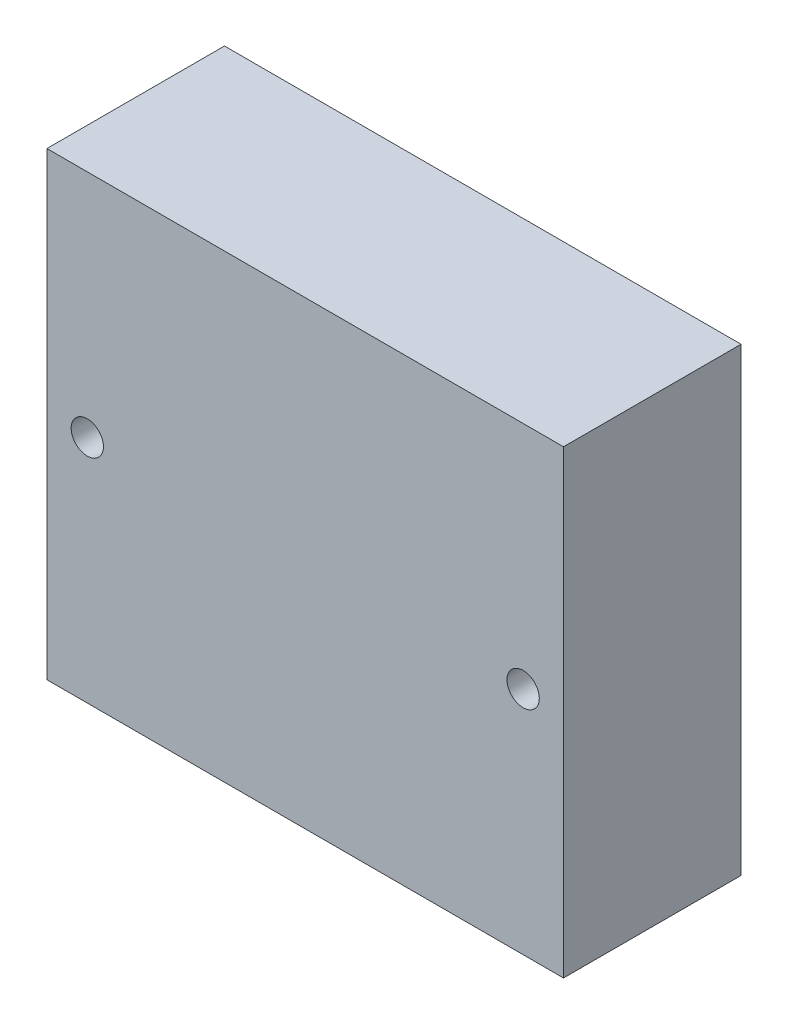
ISO-10303-21;
HEADER;
FILE_DESCRIPTION(('STEP AP214'),'2;1');
FILE_NAME('part.step','',(''),(''),'','','');
FILE_SCHEMA(('AUTOMOTIVE_DESIGN { 1 0 10303 214 1 1 1 1 }'));
ENDSEC;
DATA;
#1=APPLICATION_CONTEXT('core data for automotive mechanical design processes');
#2=APPLICATION_PROTOCOL_DEFINITION('international standard','automotive_design',2000,#1);
#3=PRODUCT_CONTEXT('',#1,'mechanical');
#4=PRODUCT('Part','Part','',(#3));
#5=PRODUCT_RELATED_PRODUCT_CATEGORY('part','',(#4));
#6=PRODUCT_DEFINITION_FORMATION('','',#4);
#7=PRODUCT_DEFINITION_CONTEXT('part definition',#1,'design');
#8=PRODUCT_DEFINITION('design','',#6,#7);
#9=PRODUCT_DEFINITION_SHAPE('','',#8);
#10=(LENGTH_UNIT() NAMED_UNIT(*) SI_UNIT(.MILLI.,.METRE.));
#11=(NAMED_UNIT(*) PLANE_ANGLE_UNIT() SI_UNIT($,.RADIAN.));
#12=(NAMED_UNIT(*) SI_UNIT($,.STERADIAN.) SOLID_ANGLE_UNIT());
#13=UNCERTAINTY_MEASURE_WITH_UNIT(LENGTH_MEASURE(1.E-05),#10,'distance_accuracy_value','');
#14=(GEOMETRIC_REPRESENTATION_CONTEXT(3) GLOBAL_UNCERTAINTY_ASSIGNED_CONTEXT((#13)) GLOBAL_UNIT_ASSIGNED_CONTEXT((#10,
#11,#12)) REPRESENTATION_CONTEXT('',''));
#15=CARTESIAN_POINT('',(0.,0.,0.));
#16=DIRECTION('',(0.,0.,1.));
#17=DIRECTION('',(1.,0.,0.));
#18=AXIS2_PLACEMENT_3D('',#15,#16,#17);
#19=CARTESIAN_POINT('',(0.,0.,22.));
#20=DIRECTION('',(0.,0.,-1.));
#21=DIRECTION('',(-1.,0.,0.));
#22=AXIS2_PLACEMENT_3D('',#19,#20,#21);
#23=PLANE('',#22);
#24=DIRECTION('',(0.,1.,0.));
#25=VECTOR('',#24,1.);
#26=CARTESIAN_POINT('',(32.,-28.5,22.));
#27=LINE('',#26,#25);
#28=CARTESIAN_POINT('',(32.,-28.5,22.));
#29=VERTEX_POINT('',#28);
#30=CARTESIAN_POINT('',(32.,28.5,22.));
#31=VERTEX_POINT('',#30);
#32=EDGE_CURVE('E91',#29,#31,#27,.T.);
#33=ORIENTED_EDGE('',*,*,#32,.T.);
#34=DIRECTION('',(-1.,0.,0.));
#35=VECTOR('',#34,1.);
#36=CARTESIAN_POINT('',(-32.,28.5,22.));
#37=LINE('',#36,#35);
#38=CARTESIAN_POINT('',(-32.,28.5,22.));
#39=VERTEX_POINT('',#38);
#40=EDGE_CURVE('E86',#31,#39,#37,.T.);
#41=ORIENTED_EDGE('',*,*,#40,.T.);
#42=DIRECTION('',(0.,-1.,0.));
#43=VECTOR('',#42,1.);
#44=CARTESIAN_POINT('',(-32.,-28.5,22.));
#45=LINE('',#44,#43);
#46=CARTESIAN_POINT('',(-32.,-28.5,22.));
#47=VERTEX_POINT('',#46);
#48=EDGE_CURVE('E87',#39,#47,#45,.T.);
#49=ORIENTED_EDGE('',*,*,#48,.T.);
#50=DIRECTION('',(1.,0.,0.));
#51=VECTOR('',#50,1.);
#52=CARTESIAN_POINT('',(-32.,-28.5,22.));
#53=LINE('',#52,#51);
#54=EDGE_CURVE('E57',#47,#29,#53,.T.);
#55=ORIENTED_EDGE('',*,*,#54,.T.);
#56=EDGE_LOOP('',(#33,#41,#49,#55));
#57=FACE_BOUND('',#56,.T.);
#58=CARTESIAN_POINT('',(-27.,0.,22.));
#59=DIRECTION('',(0.,0.,1.));
#60=DIRECTION('',(1.,0.,0.));
#61=AXIS2_PLACEMENT_3D('',#58,#59,#60);
#62=CIRCLE('',#61,2.);
#63=CARTESIAN_POINT('',(-25.,0.,22.));
#64=VERTEX_POINT('',#63);
#65=EDGE_CURVE('E106',#64,#64,#62,.T.);
#66=ORIENTED_EDGE('',*,*,#65,.F.);
#67=EDGE_LOOP('',(#66));
#68=FACE_BOUND('',#67,.T.);
#69=CARTESIAN_POINT('',(27.,0.,22.));
#70=DIRECTION('',(0.,0.,1.));
#71=DIRECTION('',(1.,0.,0.));
#72=AXIS2_PLACEMENT_3D('',#69,#70,#71);
#73=CIRCLE('',#72,2.);
#74=CARTESIAN_POINT('',(29.,0.,22.));
#75=VERTEX_POINT('',#74);
#76=EDGE_CURVE('E123',#75,#75,#73,.T.);
#77=ORIENTED_EDGE('',*,*,#76,.F.);
#78=EDGE_LOOP('',(#77));
#79=FACE_BOUND('',#78,.T.);
#80=ADVANCED_FACE('F39',(#57,#68,#79),#23,.F.);
#81=CARTESIAN_POINT('',(0.,0.,0.));
#82=DIRECTION('',(0.,0.,-1.));
#83=DIRECTION('',(-1.,0.,0.));
#84=AXIS2_PLACEMENT_3D('',#81,#82,#83);
#85=PLANE('',#84);
#86=CARTESIAN_POINT('',(-27.,0.,0.));
#87=DIRECTION('',(0.,0.,1.));
#88=DIRECTION('',(1.,0.,0.));
#89=AXIS2_PLACEMENT_3D('',#86,#87,#88);
#90=CIRCLE('',#89,2.);
#91=CARTESIAN_POINT('',(-25.,0.,0.));
#92=VERTEX_POINT('',#91);
#93=EDGE_CURVE('E119',#92,#92,#90,.T.);
#94=ORIENTED_EDGE('',*,*,#93,.T.);
#95=EDGE_LOOP('',(#94));
#96=FACE_BOUND('',#95,.T.);
#97=DIRECTION('',(0.,1.,0.));
#98=VECTOR('',#97,1.);
#99=CARTESIAN_POINT('',(32.,-28.5,0.));
#100=LINE('',#99,#98);
#101=CARTESIAN_POINT('',(32.,-28.5,0.));
#102=VERTEX_POINT('',#101);
#103=CARTESIAN_POINT('',(32.,28.5,0.));
#104=VERTEX_POINT('',#103);
#105=EDGE_CURVE('E104',#102,#104,#100,.T.);
#106=ORIENTED_EDGE('',*,*,#105,.F.);
#107=DIRECTION('',(1.,0.,0.));
#108=VECTOR('',#107,1.);
#109=CARTESIAN_POINT('',(-32.,-28.5,0.));
#110=LINE('',#109,#108);
#111=CARTESIAN_POINT('',(-32.,-28.5,0.));
#112=VERTEX_POINT('',#111);
#113=EDGE_CURVE('E80',#112,#102,#110,.T.);
#114=ORIENTED_EDGE('',*,*,#113,.F.);
#115=DIRECTION('',(0.,-1.,0.));
#116=VECTOR('',#115,1.);
#117=CARTESIAN_POINT('',(-32.,-28.5,0.));
#118=LINE('',#117,#116);
#119=CARTESIAN_POINT('',(-32.,28.5,0.));
#120=VERTEX_POINT('',#119);
#121=EDGE_CURVE('E74',#120,#112,#118,.T.);
#122=ORIENTED_EDGE('',*,*,#121,.F.);
#123=DIRECTION('',(-1.,0.,0.));
#124=VECTOR('',#123,1.);
#125=CARTESIAN_POINT('',(-32.,28.5,0.));
#126=LINE('',#125,#124);
#127=EDGE_CURVE('E94',#104,#120,#126,.T.);
#128=ORIENTED_EDGE('',*,*,#127,.F.);
#129=EDGE_LOOP('',(#106,#114,#122,#128));
#130=FACE_BOUND('',#129,.T.);
#131=CARTESIAN_POINT('',(27.,0.,0.));
#132=DIRECTION('',(0.,0.,1.));
#133=DIRECTION('',(1.,0.,0.));
#134=AXIS2_PLACEMENT_3D('',#131,#132,#133);
#135=CIRCLE('',#134,2.);
#136=CARTESIAN_POINT('',(29.,0.,0.));
#137=VERTEX_POINT('',#136);
#138=EDGE_CURVE('E125',#137,#137,#135,.T.);
#139=ORIENTED_EDGE('',*,*,#138,.T.);
#140=EDGE_LOOP('',(#139));
#141=FACE_BOUND('',#140,.T.);
#142=ADVANCED_FACE('F114',(#96,#130,#141),#85,.T.);
#143=CARTESIAN_POINT('',(32.,-28.5,22.));
#144=DIRECTION('',(-1.,0.,0.));
#145=DIRECTION('',(0.,0.,1.));
#146=AXIS2_PLACEMENT_3D('',#143,#144,#145);
#147=PLANE('',#146);
#148=ORIENTED_EDGE('',*,*,#105,.T.);
#149=DIRECTION('',(0.,0.,-1.));
#150=VECTOR('',#149,1.);
#151=CARTESIAN_POINT('',(32.,28.5,22.));
#152=LINE('',#151,#150);
#153=EDGE_CURVE('E11',#31,#104,#152,.T.);
#154=ORIENTED_EDGE('',*,*,#153,.F.);
#155=ORIENTED_EDGE('',*,*,#32,.F.);
#156=DIRECTION('',(0.,0.,-1.));
#157=VECTOR('',#156,1.);
#158=CARTESIAN_POINT('',(32.,-28.5,22.));
#159=LINE('',#158,#157);
#160=EDGE_CURVE('E98',#29,#102,#159,.T.);
#161=ORIENTED_EDGE('',*,*,#160,.T.);
#162=EDGE_LOOP('',(#148,#154,#155,#161));
#163=FACE_BOUND('',#162,.T.);
#164=ADVANCED_FACE('F41',(#163),#147,.F.);
#165=CARTESIAN_POINT('',(-32.,28.5,22.));
#166=DIRECTION('',(0.,-1.,0.));
#167=DIRECTION('',(0.,0.,-1.));
#168=AXIS2_PLACEMENT_3D('',#165,#166,#167);
#169=PLANE('',#168);
#170=ORIENTED_EDGE('',*,*,#127,.T.);
#171=DIRECTION('',(0.,0.,-1.));
#172=VECTOR('',#171,1.);
#173=CARTESIAN_POINT('',(-32.,28.5,22.));
#174=LINE('',#173,#172);
#175=EDGE_CURVE('E48',#39,#120,#174,.T.);
#176=ORIENTED_EDGE('',*,*,#175,.F.);
#177=ORIENTED_EDGE('',*,*,#40,.F.);
#178=ORIENTED_EDGE('',*,*,#153,.T.);
#179=EDGE_LOOP('',(#170,#176,#177,#178));
#180=FACE_BOUND('',#179,.T.);
#181=ADVANCED_FACE('F92',(#180),#169,.F.);
#182=CARTESIAN_POINT('',(-32.,-28.5,22.));
#183=DIRECTION('',(1.,0.,0.));
#184=DIRECTION('',(0.,0.,-1.));
#185=AXIS2_PLACEMENT_3D('',#182,#183,#184);
#186=PLANE('',#185);
#187=ORIENTED_EDGE('',*,*,#121,.T.);
#188=DIRECTION('',(0.,0.,-1.));
#189=VECTOR('',#188,1.);
#190=CARTESIAN_POINT('',(-32.,-28.5,22.));
#191=LINE('',#190,#189);
#192=EDGE_CURVE('E96',#47,#112,#191,.T.);
#193=ORIENTED_EDGE('',*,*,#192,.F.);
#194=ORIENTED_EDGE('',*,*,#48,.F.);
#195=ORIENTED_EDGE('',*,*,#175,.T.);
#196=EDGE_LOOP('',(#187,#193,#194,#195));
#197=FACE_BOUND('',#196,.T.);
#198=ADVANCED_FACE('F100',(#197),#186,.F.);
#199=CARTESIAN_POINT('',(-32.,-28.5,22.));
#200=DIRECTION('',(0.,1.,0.));
#201=DIRECTION('',(0.,0.,1.));
#202=AXIS2_PLACEMENT_3D('',#199,#200,#201);
#203=PLANE('',#202);
#204=ORIENTED_EDGE('',*,*,#113,.T.);
#205=ORIENTED_EDGE('',*,*,#160,.F.);
#206=ORIENTED_EDGE('',*,*,#54,.F.);
#207=ORIENTED_EDGE('',*,*,#192,.T.);
#208=EDGE_LOOP('',(#204,#205,#206,#207));
#209=FACE_BOUND('',#208,.T.);
#210=ADVANCED_FACE('F112',(#209),#203,.F.);
#211=CARTESIAN_POINT('',(-27.,0.,22.));
#212=DIRECTION('',(0.,0.,-1.));
#213=DIRECTION('',(-1.,0.,0.));
#214=AXIS2_PLACEMENT_3D('',#211,#212,#213);
#215=CYLINDRICAL_SURFACE('',#214,2.);
#216=ORIENTED_EDGE('',*,*,#65,.T.);
#217=EDGE_LOOP('',(#216));
#218=FACE_BOUND('',#217,.T.);
#219=ORIENTED_EDGE('',*,*,#93,.F.);
#220=EDGE_LOOP('',(#219));
#221=FACE_BOUND('',#220,.T.);
#222=ADVANCED_FACE('F141',(#218,#221),#215,.F.);
#223=CARTESIAN_POINT('',(27.,0.,22.));
#224=DIRECTION('',(0.,0.,-1.));
#225=DIRECTION('',(-1.,0.,0.));
#226=AXIS2_PLACEMENT_3D('',#223,#224,#225);
#227=CYLINDRICAL_SURFACE('',#226,2.);
#228=ORIENTED_EDGE('',*,*,#76,.T.);
#229=EDGE_LOOP('',(#228));
#230=FACE_BOUND('',#229,.T.);
#231=ORIENTED_EDGE('',*,*,#138,.F.);
#232=EDGE_LOOP('',(#231));
#233=FACE_BOUND('',#232,.T.);
#234=ADVANCED_FACE('F127',(#230,#233),#227,.F.);
#235=CLOSED_SHELL('',(#80,#142,#164,#181,#198,#210,#222,#234));
#236=MANIFOLD_SOLID_BREP('B2',#235);
#237=ADVANCED_BREP_SHAPE_REPRESENTATION('',(#18,#236),#14);
#238=SHAPE_DEFINITION_REPRESENTATION(#9,#237);
ENDSEC;
END-ISO-10303-21;
